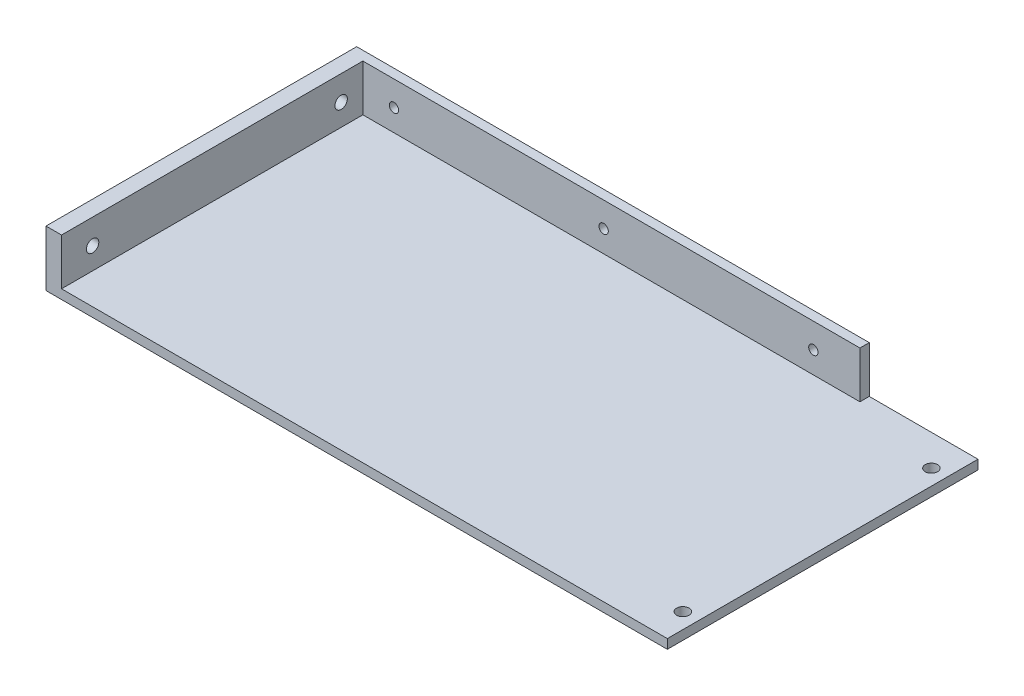
ISO-10303-21;
HEADER;
FILE_DESCRIPTION(('STEP AP214'),'2;1');
FILE_NAME('part.step','',(''),(''),'','','');
FILE_SCHEMA(('AUTOMOTIVE_DESIGN { 1 0 10303 214 1 1 1 1 }'));
ENDSEC;
DATA;
#1=APPLICATION_CONTEXT('core data for automotive mechanical design processes');
#2=APPLICATION_PROTOCOL_DEFINITION('international standard','automotive_design',2000,#1);
#3=PRODUCT_CONTEXT('',#1,'mechanical');
#4=PRODUCT('Part','Part','',(#3));
#5=PRODUCT_RELATED_PRODUCT_CATEGORY('part','',(#4));
#6=PRODUCT_DEFINITION_FORMATION('','',#4);
#7=PRODUCT_DEFINITION_CONTEXT('part definition',#1,'design');
#8=PRODUCT_DEFINITION('design','',#6,#7);
#9=PRODUCT_DEFINITION_SHAPE('','',#8);
#10=(LENGTH_UNIT() NAMED_UNIT(*) SI_UNIT(.MILLI.,.METRE.));
#11=(NAMED_UNIT(*) PLANE_ANGLE_UNIT() SI_UNIT($,.RADIAN.));
#12=(NAMED_UNIT(*) SI_UNIT($,.STERADIAN.) SOLID_ANGLE_UNIT());
#13=UNCERTAINTY_MEASURE_WITH_UNIT(LENGTH_MEASURE(1.E-05),#10,'distance_accuracy_value','');
#14=(GEOMETRIC_REPRESENTATION_CONTEXT(3) GLOBAL_UNCERTAINTY_ASSIGNED_CONTEXT((#13)) GLOBAL_UNIT_ASSIGNED_CONTEXT((#10,
#11,#12)) REPRESENTATION_CONTEXT('',''));
#15=CARTESIAN_POINT('',(0.,0.,0.));
#16=DIRECTION('',(0.,0.,1.));
#17=DIRECTION('',(1.,0.,0.));
#18=AXIS2_PLACEMENT_3D('',#15,#16,#17);
#19=CARTESIAN_POINT('',(0.,3.,0.));
#20=DIRECTION('',(0.,-1.,0.));
#21=DIRECTION('',(0.,0.,-1.));
#22=AXIS2_PLACEMENT_3D('',#19,#20,#21);
#23=PLANE('',#22);
#24=CARTESIAN_POINT('',(95.,3.,-40.));
#25=DIRECTION('',(0.,1.,0.));
#26=DIRECTION('',(0.,0.,1.));
#27=AXIS2_PLACEMENT_3D('',#24,#25,#26);
#28=CIRCLE('',#27,2.);
#29=CARTESIAN_POINT('',(95.,3.,-38.));
#30=VERTEX_POINT('',#29);
#31=EDGE_CURVE('E197',#30,#30,#28,.T.);
#32=ORIENTED_EDGE('',*,*,#31,.F.);
#33=EDGE_LOOP('',(#32));
#34=FACE_BOUND('',#33,.T.);
#35=CARTESIAN_POINT('',(95.,3.,40.));
#36=DIRECTION('',(0.,1.,0.));
#37=DIRECTION('',(0.,0.,1.));
#38=AXIS2_PLACEMENT_3D('',#35,#36,#37);
#39=CIRCLE('',#38,2.);
#40=CARTESIAN_POINT('',(95.,3.,42.));
#41=VERTEX_POINT('',#40);
#42=EDGE_CURVE('E189',#41,#41,#39,.T.);
#43=ORIENTED_EDGE('',*,*,#42,.F.);
#44=EDGE_LOOP('',(#43));
#45=FACE_BOUND('',#44,.T.);
#46=DIRECTION('',(1.,0.,0.));
#47=VECTOR('',#46,1.);
#48=CARTESIAN_POINT('',(-95.,3.,-47.));
#49=LINE('',#48,#47);
#50=CARTESIAN_POINT('',(-95.,3.,-47.));
#51=VERTEX_POINT('',#50);
#52=CARTESIAN_POINT('',(65.,3.,-47.));
#53=VERTEX_POINT('',#52);
#54=EDGE_CURVE('E235',#51,#53,#49,.T.);
#55=ORIENTED_EDGE('',*,*,#54,.F.);
#56=DIRECTION('',(0.,0.,-1.));
#57=VECTOR('',#56,1.);
#58=CARTESIAN_POINT('',(-95.,3.,-50.));
#59=LINE('',#58,#57);
#60=CARTESIAN_POINT('',(-94.9999999999999,3.,50.));
#61=VERTEX_POINT('',#60);
#62=EDGE_CURVE('E59',#61,#51,#59,.T.);
#63=ORIENTED_EDGE('',*,*,#62,.F.);
#64=DIRECTION('',(1.,0.,0.));
#65=VECTOR('',#64,1.);
#66=CARTESIAN_POINT('',(-100.,3.,50.));
#67=LINE('',#66,#65);
#68=CARTESIAN_POINT('',(100.,3.,50.));
#69=VERTEX_POINT('',#68);
#70=EDGE_CURVE('E64',#61,#69,#67,.T.);
#71=ORIENTED_EDGE('',*,*,#70,.T.);
#72=DIRECTION('',(0.,0.,-1.));
#73=VECTOR('',#72,1.);
#74=CARTESIAN_POINT('',(100.,3.,50.));
#75=LINE('',#74,#73);
#76=CARTESIAN_POINT('',(100.,3.,-50.));
#77=VERTEX_POINT('',#76);
#78=EDGE_CURVE('E96',#69,#77,#75,.T.);
#79=ORIENTED_EDGE('',*,*,#78,.T.);
#80=DIRECTION('',(-1.,0.,0.));
#81=VECTOR('',#80,1.);
#82=CARTESIAN_POINT('',(-100.,3.,-50.));
#83=LINE('',#82,#81);
#84=CARTESIAN_POINT('',(65.,3.,-50.));
#85=VERTEX_POINT('',#84);
#86=EDGE_CURVE('E159',#77,#85,#83,.T.);
#87=ORIENTED_EDGE('',*,*,#86,.T.);
#88=DIRECTION('',(0.,0.,-1.));
#89=VECTOR('',#88,1.);
#90=CARTESIAN_POINT('',(65.,3.,-50.));
#91=LINE('',#90,#89);
#92=EDGE_CURVE('E167',#53,#85,#91,.T.);
#93=ORIENTED_EDGE('',*,*,#92,.F.);
#94=EDGE_LOOP('',(#55,#63,#71,#79,#87,#93));
#95=FACE_BOUND('',#94,.T.);
#96=ADVANCED_FACE('F43',(#34,#45,#95),#23,.F.);
#97=CARTESIAN_POINT('',(-95.,18.,-50.));
#98=DIRECTION('',(-1.,0.,0.));
#99=DIRECTION('',(0.,0.,1.));
#100=AXIS2_PLACEMENT_3D('',#97,#98,#99);
#101=PLANE('',#100);
#102=CARTESIAN_POINT('',(-95.,10.,40.));
#103=DIRECTION('',(-1.,0.,0.));
#104=DIRECTION('',(0.,0.,1.));
#105=AXIS2_PLACEMENT_3D('',#102,#103,#104);
#106=CIRCLE('',#105,2.);
#107=CARTESIAN_POINT('',(-95.,10.,42.));
#108=VERTEX_POINT('',#107);
#109=EDGE_CURVE('E156',#108,#108,#106,.F.);
#110=ORIENTED_EDGE('',*,*,#109,.F.);
#111=EDGE_LOOP('',(#110));
#112=FACE_BOUND('',#111,.T.);
#113=CARTESIAN_POINT('',(-95.,10.,-40.));
#114=DIRECTION('',(-1.,0.,0.));
#115=DIRECTION('',(0.,0.,1.));
#116=AXIS2_PLACEMENT_3D('',#113,#114,#115);
#117=CIRCLE('',#116,2.);
#118=CARTESIAN_POINT('',(-95.,10.,-38.));
#119=VERTEX_POINT('',#118);
#120=EDGE_CURVE('E208',#119,#119,#117,.F.);
#121=ORIENTED_EDGE('',*,*,#120,.F.);
#122=EDGE_LOOP('',(#121));
#123=FACE_BOUND('',#122,.T.);
#124=DIRECTION('',(0.,-1.,0.));
#125=VECTOR('',#124,1.);
#126=CARTESIAN_POINT('',(-95.,18.,-47.));
#127=LINE('',#126,#125);
#128=CARTESIAN_POINT('',(-95.,18.,-47.));
#129=VERTEX_POINT('',#128);
#130=EDGE_CURVE('E178',#129,#51,#127,.T.);
#131=ORIENTED_EDGE('',*,*,#130,.F.);
#132=DIRECTION('',(0.,0.,-1.));
#133=VECTOR('',#132,1.);
#134=CARTESIAN_POINT('',(-95.,18.,-50.));
#135=LINE('',#134,#133);
#136=CARTESIAN_POINT('',(-94.9999999999999,18.,50.));
#137=VERTEX_POINT('',#136);
#138=EDGE_CURVE('E147',#137,#129,#135,.T.);
#139=ORIENTED_EDGE('',*,*,#138,.F.);
#140=DIRECTION('',(0.,-1.,0.));
#141=VECTOR('',#140,1.);
#142=CARTESIAN_POINT('',(-94.9999999999999,18.,50.));
#143=LINE('',#142,#141);
#144=EDGE_CURVE('E108',#137,#61,#143,.T.);
#145=ORIENTED_EDGE('',*,*,#144,.T.);
#146=ORIENTED_EDGE('',*,*,#62,.T.);
#147=EDGE_LOOP('',(#131,#139,#145,#146));
#148=FACE_BOUND('',#147,.T.);
#149=ADVANCED_FACE('F226',(#112,#123,#148),#101,.F.);
#150=CARTESIAN_POINT('',(100.,3.,50.));
#151=DIRECTION('',(-1.,0.,0.));
#152=DIRECTION('',(0.,0.,1.));
#153=AXIS2_PLACEMENT_3D('',#150,#151,#152);
#154=PLANE('',#153);
#155=DIRECTION('',(0.,0.,-1.));
#156=VECTOR('',#155,1.);
#157=CARTESIAN_POINT('',(100.,0.,50.));
#158=LINE('',#157,#156);
#159=CARTESIAN_POINT('',(100.,0.,50.));
#160=VERTEX_POINT('',#159);
#161=CARTESIAN_POINT('',(100.,0.,-50.));
#162=VERTEX_POINT('',#161);
#163=EDGE_CURVE('E102',#160,#162,#158,.T.);
#164=ORIENTED_EDGE('',*,*,#163,.T.);
#165=DIRECTION('',(0.,-1.,0.));
#166=VECTOR('',#165,1.);
#167=CARTESIAN_POINT('',(100.,3.,-50.));
#168=LINE('',#167,#166);
#169=EDGE_CURVE('E11',#77,#162,#168,.T.);
#170=ORIENTED_EDGE('',*,*,#169,.F.);
#171=ORIENTED_EDGE('',*,*,#78,.F.);
#172=DIRECTION('',(0.,-1.,0.));
#173=VECTOR('',#172,1.);
#174=CARTESIAN_POINT('',(100.,3.,50.));
#175=LINE('',#174,#173);
#176=EDGE_CURVE('E87',#69,#160,#175,.T.);
#177=ORIENTED_EDGE('',*,*,#176,.T.);
#178=EDGE_LOOP('',(#164,#170,#171,#177));
#179=FACE_BOUND('',#178,.T.);
#180=ADVANCED_FACE('F45',(#179),#154,.F.);
#181=CARTESIAN_POINT('',(-100.,3.,-50.));
#182=DIRECTION('',(0.,0.,1.));
#183=DIRECTION('',(1.,0.,0.));
#184=AXIS2_PLACEMENT_3D('',#181,#182,#183);
#185=PLANE('',#184);
#186=CARTESIAN_POINT('',(-85.,10.,-50.));
#187=DIRECTION('',(0.,0.,-1.));
#188=DIRECTION('',(-1.,0.,0.));
#189=AXIS2_PLACEMENT_3D('',#186,#187,#188);
#190=CIRCLE('',#189,1.5);
#191=CARTESIAN_POINT('',(-86.5,10.,-50.));
#192=VERTEX_POINT('',#191);
#193=EDGE_CURVE('E242',#192,#192,#190,.T.);
#194=ORIENTED_EDGE('',*,*,#193,.F.);
#195=EDGE_LOOP('',(#194));
#196=FACE_BOUND('',#195,.T.);
#197=CARTESIAN_POINT('',(-17.4999999999999,10.,-50.));
#198=DIRECTION('',(0.,0.,-1.));
#199=DIRECTION('',(-1.,0.,0.));
#200=AXIS2_PLACEMENT_3D('',#197,#198,#199);
#201=CIRCLE('',#200,1.5);
#202=CARTESIAN_POINT('',(-18.9999999999999,10.,-50.));
#203=VERTEX_POINT('',#202);
#204=EDGE_CURVE('E256',#203,#203,#201,.T.);
#205=ORIENTED_EDGE('',*,*,#204,.F.);
#206=EDGE_LOOP('',(#205));
#207=FACE_BOUND('',#206,.T.);
#208=CARTESIAN_POINT('',(50.0000000000001,10.,-50.));
#209=DIRECTION('',(0.,0.,-1.));
#210=DIRECTION('',(-1.,0.,0.));
#211=AXIS2_PLACEMENT_3D('',#208,#209,#210);
#212=CIRCLE('',#211,1.5);
#213=CARTESIAN_POINT('',(48.5000000000001,10.,-50.));
#214=VERTEX_POINT('',#213);
#215=EDGE_CURVE('E247',#214,#214,#212,.T.);
#216=ORIENTED_EDGE('',*,*,#215,.F.);
#217=EDGE_LOOP('',(#216));
#218=FACE_BOUND('',#217,.T.);
#219=DIRECTION('',(-1.,0.,0.));
#220=VECTOR('',#219,1.);
#221=CARTESIAN_POINT('',(-100.,0.,-50.));
#222=LINE('',#221,#220);
#223=CARTESIAN_POINT('',(-100.,0.,-50.));
#224=VERTEX_POINT('',#223);
#225=EDGE_CURVE('E106',#162,#224,#222,.T.);
#226=ORIENTED_EDGE('',*,*,#225,.T.);
#227=DIRECTION('',(0.,-1.,0.));
#228=VECTOR('',#227,1.);
#229=CARTESIAN_POINT('',(-100.,3.,-50.));
#230=LINE('',#229,#228);
#231=CARTESIAN_POINT('',(-100.,18.,-50.));
#232=VERTEX_POINT('',#231);
#233=EDGE_CURVE('E52',#232,#224,#230,.T.);
#234=ORIENTED_EDGE('',*,*,#233,.F.);
#235=DIRECTION('',(-1.,0.,0.));
#236=VECTOR('',#235,1.);
#237=CARTESIAN_POINT('',(-100.,18.,-50.));
#238=LINE('',#237,#236);
#239=CARTESIAN_POINT('',(65.,18.,-50.));
#240=VERTEX_POINT('',#239);
#241=EDGE_CURVE('E114',#240,#232,#238,.T.);
#242=ORIENTED_EDGE('',*,*,#241,.F.);
#243=DIRECTION('',(0.,-1.,0.));
#244=VECTOR('',#243,1.);
#245=CARTESIAN_POINT('',(65.,18.,-50.));
#246=LINE('',#245,#244);
#247=EDGE_CURVE('E170',#240,#85,#246,.T.);
#248=ORIENTED_EDGE('',*,*,#247,.T.);
#249=ORIENTED_EDGE('',*,*,#86,.F.);
#250=ORIENTED_EDGE('',*,*,#169,.T.);
#251=EDGE_LOOP('',(#226,#234,#242,#248,#249,#250));
#252=FACE_BOUND('',#251,.T.);
#253=ADVANCED_FACE('F133',(#196,#207,#218,#252),#185,.F.);
#254=CARTESIAN_POINT('',(-100.,3.,50.));
#255=DIRECTION('',(1.,0.,0.));
#256=DIRECTION('',(0.,0.,-1.));
#257=AXIS2_PLACEMENT_3D('',#254,#255,#256);
#258=PLANE('',#257);
#259=CARTESIAN_POINT('',(-100.,10.,-40.));
#260=DIRECTION('',(-1.,0.,0.));
#261=DIRECTION('',(0.,0.,1.));
#262=AXIS2_PLACEMENT_3D('',#259,#260,#261);
#263=CIRCLE('',#262,2.);
#264=CARTESIAN_POINT('',(-100.,10.,-38.));
#265=VERTEX_POINT('',#264);
#266=EDGE_CURVE('E201',#265,#265,#263,.T.);
#267=ORIENTED_EDGE('',*,*,#266,.F.);
#268=EDGE_LOOP('',(#267));
#269=FACE_BOUND('',#268,.T.);
#270=CARTESIAN_POINT('',(-100.,10.,40.));
#271=DIRECTION('',(-1.,0.,0.));
#272=DIRECTION('',(0.,0.,1.));
#273=AXIS2_PLACEMENT_3D('',#270,#271,#272);
#274=CIRCLE('',#273,2.);
#275=CARTESIAN_POINT('',(-100.,10.,42.));
#276=VERTEX_POINT('',#275);
#277=EDGE_CURVE('E212',#276,#276,#274,.T.);
#278=ORIENTED_EDGE('',*,*,#277,.F.);
#279=EDGE_LOOP('',(#278));
#280=FACE_BOUND('',#279,.T.);
#281=DIRECTION('',(0.,0.,1.));
#282=VECTOR('',#281,1.);
#283=CARTESIAN_POINT('',(-100.,0.,50.));
#284=LINE('',#283,#282);
#285=CARTESIAN_POINT('',(-100.,0.,50.));
#286=VERTEX_POINT('',#285);
#287=EDGE_CURVE('E97',#224,#286,#284,.T.);
#288=ORIENTED_EDGE('',*,*,#287,.T.);
#289=DIRECTION('',(0.,-1.,0.));
#290=VECTOR('',#289,1.);
#291=CARTESIAN_POINT('',(-100.,3.,50.));
#292=LINE('',#291,#290);
#293=CARTESIAN_POINT('',(-99.9999999999999,18.,50.));
#294=VERTEX_POINT('',#293);
#295=EDGE_CURVE('E91',#294,#286,#292,.T.);
#296=ORIENTED_EDGE('',*,*,#295,.F.);
#297=DIRECTION('',(0.,0.,1.));
#298=VECTOR('',#297,1.);
#299=CARTESIAN_POINT('',(-100.,18.,-50.));
#300=LINE('',#299,#298);
#301=EDGE_CURVE('E129',#232,#294,#300,.T.);
#302=ORIENTED_EDGE('',*,*,#301,.F.);
#303=ORIENTED_EDGE('',*,*,#233,.T.);
#304=EDGE_LOOP('',(#288,#296,#302,#303));
#305=FACE_BOUND('',#304,.T.);
#306=ADVANCED_FACE('F127',(#269,#280,#305),#258,.F.);
#307=CARTESIAN_POINT('',(-100.,3.,50.));
#308=DIRECTION('',(0.,0.,-1.));
#309=DIRECTION('',(-1.,0.,0.));
#310=AXIS2_PLACEMENT_3D('',#307,#308,#309);
#311=PLANE('',#310);
#312=DIRECTION('',(1.,0.,0.));
#313=VECTOR('',#312,1.);
#314=CARTESIAN_POINT('',(-100.,0.,50.));
#315=LINE('',#314,#313);
#316=EDGE_CURVE('E84',#286,#160,#315,.T.);
#317=ORIENTED_EDGE('',*,*,#316,.T.);
#318=ORIENTED_EDGE('',*,*,#176,.F.);
#319=ORIENTED_EDGE('',*,*,#70,.F.);
#320=ORIENTED_EDGE('',*,*,#144,.F.);
#321=DIRECTION('',(1.,0.,0.));
#322=VECTOR('',#321,1.);
#323=CARTESIAN_POINT('',(-99.9999999999999,18.,50.));
#324=LINE('',#323,#322);
#325=EDGE_CURVE('E151',#294,#137,#324,.T.);
#326=ORIENTED_EDGE('',*,*,#325,.F.);
#327=ORIENTED_EDGE('',*,*,#295,.T.);
#328=EDGE_LOOP('',(#317,#318,#319,#320,#326,#327));
#329=FACE_BOUND('',#328,.T.);
#330=ADVANCED_FACE('F86',(#329),#311,.F.);
#331=CARTESIAN_POINT('',(0.,0.,0.));
#332=DIRECTION('',(0.,-1.,0.));
#333=DIRECTION('',(0.,0.,-1.));
#334=AXIS2_PLACEMENT_3D('',#331,#332,#333);
#335=PLANE('',#334);
#336=CARTESIAN_POINT('',(95.,0.,40.));
#337=DIRECTION('',(0.,-1.,0.));
#338=DIRECTION('',(0.,0.,-1.));
#339=AXIS2_PLACEMENT_3D('',#336,#337,#338);
#340=CIRCLE('',#339,2.);
#341=CARTESIAN_POINT('',(95.,0.,42.));
#342=VERTEX_POINT('',#341);
#343=EDGE_CURVE('E188',#342,#342,#340,.F.);
#344=ORIENTED_EDGE('',*,*,#343,.T.);
#345=EDGE_LOOP('',(#344));
#346=FACE_BOUND('',#345,.T.);
#347=CARTESIAN_POINT('',(95.,0.,-40.));
#348=DIRECTION('',(0.,-1.,0.));
#349=DIRECTION('',(0.,0.,-1.));
#350=AXIS2_PLACEMENT_3D('',#347,#348,#349);
#351=CIRCLE('',#350,2.);
#352=CARTESIAN_POINT('',(95.,0.,-38.));
#353=VERTEX_POINT('',#352);
#354=EDGE_CURVE('E193',#353,#353,#351,.F.);
#355=ORIENTED_EDGE('',*,*,#354,.T.);
#356=EDGE_LOOP('',(#355));
#357=FACE_BOUND('',#356,.T.);
#358=ORIENTED_EDGE('',*,*,#163,.F.);
#359=ORIENTED_EDGE('',*,*,#316,.F.);
#360=ORIENTED_EDGE('',*,*,#287,.F.);
#361=ORIENTED_EDGE('',*,*,#225,.F.);
#362=EDGE_LOOP('',(#358,#359,#360,#361));
#363=FACE_BOUND('',#362,.T.);
#364=ADVANCED_FACE('F105',(#346,#357,#363),#335,.T.);
#365=CARTESIAN_POINT('',(0.,18.,0.));
#366=DIRECTION('',(0.,1.,0.));
#367=DIRECTION('',(0.,0.,1.));
#368=AXIS2_PLACEMENT_3D('',#365,#366,#367);
#369=PLANE('',#368);
#370=ORIENTED_EDGE('',*,*,#301,.T.);
#371=ORIENTED_EDGE('',*,*,#325,.T.);
#372=ORIENTED_EDGE('',*,*,#138,.T.);
#373=DIRECTION('',(1.,0.,0.));
#374=VECTOR('',#373,1.);
#375=CARTESIAN_POINT('',(-95.,18.,-47.));
#376=LINE('',#375,#374);
#377=CARTESIAN_POINT('',(65.,18.,-47.));
#378=VERTEX_POINT('',#377);
#379=EDGE_CURVE('E180',#129,#378,#376,.T.);
#380=ORIENTED_EDGE('',*,*,#379,.T.);
#381=DIRECTION('',(0.,0.,-1.));
#382=VECTOR('',#381,1.);
#383=CARTESIAN_POINT('',(65.,18.,-50.));
#384=LINE('',#383,#382);
#385=EDGE_CURVE('E144',#378,#240,#384,.T.);
#386=ORIENTED_EDGE('',*,*,#385,.T.);
#387=ORIENTED_EDGE('',*,*,#241,.T.);
#388=EDGE_LOOP('',(#370,#371,#372,#380,#386,#387));
#389=FACE_BOUND('',#388,.T.);
#390=ADVANCED_FACE('F139',(#389),#369,.T.);
#391=CARTESIAN_POINT('',(100.001,10.,40.));
#392=DIRECTION('',(-1.,0.,0.));
#393=DIRECTION('',(0.,0.,1.));
#394=AXIS2_PLACEMENT_3D('',#391,#392,#393);
#395=CYLINDRICAL_SURFACE('',#394,2.);
#396=CARTESIAN_POINT('',(-100.,10.,42.));
#397=CARTESIAN_POINT('',(-99.9479166666666,10.,42.));
#398=CARTESIAN_POINT('',(-99.8958333333333,10.,42.));
#399=CARTESIAN_POINT('',(-99.7916666666666,10.,42.));
#400=CARTESIAN_POINT('',(-99.7395833333333,10.,42.));
#401=CARTESIAN_POINT('',(-99.6354166666666,10.,42.));
#402=CARTESIAN_POINT('',(-99.5833333333333,10.,42.));
#403=CARTESIAN_POINT('',(-99.4791666666666,10.,42.));
#404=CARTESIAN_POINT('',(-99.4270833333333,10.,42.));
#405=CARTESIAN_POINT('',(-99.3229166666666,10.,42.));
#406=CARTESIAN_POINT('',(-99.2708333333333,10.,42.));
#407=CARTESIAN_POINT('',(-99.1666666666666,10.,42.));
#408=CARTESIAN_POINT('',(-99.1145833333333,10.,42.));
#409=CARTESIAN_POINT('',(-99.0104166666666,10.,42.));
#410=CARTESIAN_POINT('',(-98.9583333333333,10.,42.));
#411=CARTESIAN_POINT('',(-98.8541666666666,10.,42.));
#412=CARTESIAN_POINT('',(-98.8020833333333,10.,42.));
#413=CARTESIAN_POINT('',(-98.6979166666666,10.,42.));
#414=CARTESIAN_POINT('',(-98.6458333333333,10.,42.));
#415=CARTESIAN_POINT('',(-98.5416666666666,10.,42.));
#416=CARTESIAN_POINT('',(-98.4895833333333,10.,42.));
#417=CARTESIAN_POINT('',(-98.3854166666666,10.,42.));
#418=CARTESIAN_POINT('',(-98.3333333333333,10.,42.));
#419=CARTESIAN_POINT('',(-98.2291666666666,10.,42.));
#420=CARTESIAN_POINT('',(-98.1770833333333,10.,42.));
#421=CARTESIAN_POINT('',(-98.0729166666666,10.,42.));
#422=CARTESIAN_POINT('',(-98.0208333333333,10.,42.));
#423=CARTESIAN_POINT('',(-97.9166666666666,10.,42.));
#424=CARTESIAN_POINT('',(-97.8645833333333,10.,42.));
#425=CARTESIAN_POINT('',(-97.7604166666666,10.,42.));
#426=CARTESIAN_POINT('',(-97.7083333333333,10.,42.));
#427=CARTESIAN_POINT('',(-97.6041666666666,10.,42.));
#428=CARTESIAN_POINT('',(-97.5520833333333,10.,42.));
#429=CARTESIAN_POINT('',(-97.4479166666666,10.,42.));
#430=CARTESIAN_POINT('',(-97.3958333333333,10.,42.));
#431=CARTESIAN_POINT('',(-97.2916666666666,10.,42.));
#432=CARTESIAN_POINT('',(-97.2395833333333,10.,42.));
#433=CARTESIAN_POINT('',(-97.1354166666666,10.,42.));
#434=CARTESIAN_POINT('',(-97.0833333333333,10.,42.));
#435=CARTESIAN_POINT('',(-96.9791666666666,10.,42.));
#436=CARTESIAN_POINT('',(-96.9270833333333,10.,42.));
#437=CARTESIAN_POINT('',(-96.8229166666666,10.,42.));
#438=CARTESIAN_POINT('',(-96.7708333333333,10.,42.));
#439=CARTESIAN_POINT('',(-96.6666666666666,10.,42.));
#440=CARTESIAN_POINT('',(-96.6145833333333,10.,42.));
#441=CARTESIAN_POINT('',(-96.5104166666666,10.,42.));
#442=CARTESIAN_POINT('',(-96.4583333333333,10.,42.));
#443=CARTESIAN_POINT('',(-96.3541666666666,10.,42.));
#444=CARTESIAN_POINT('',(-96.3020833333333,10.,42.));
#445=CARTESIAN_POINT('',(-96.1979166666666,10.,42.));
#446=CARTESIAN_POINT('',(-96.1458333333333,10.,42.));
#447=CARTESIAN_POINT('',(-96.0416666666666,10.,42.));
#448=CARTESIAN_POINT('',(-95.9895833333333,10.,42.));
#449=CARTESIAN_POINT('',(-95.8854166666666,10.,42.));
#450=CARTESIAN_POINT('',(-95.8333333333333,10.,42.));
#451=CARTESIAN_POINT('',(-95.7291666666666,10.,42.));
#452=CARTESIAN_POINT('',(-95.6770833333333,10.,42.));
#453=CARTESIAN_POINT('',(-95.5729166666666,10.,42.));
#454=CARTESIAN_POINT('',(-95.5208333333333,10.,42.));
#455=CARTESIAN_POINT('',(-95.4166666666666,10.,42.));
#456=CARTESIAN_POINT('',(-95.3645833333333,10.,42.));
#457=CARTESIAN_POINT('',(-95.2604166666666,10.,42.));
#458=CARTESIAN_POINT('',(-95.2083333333333,10.,42.));
#459=CARTESIAN_POINT('',(-95.1041666666666,10.,42.));
#460=CARTESIAN_POINT('',(-95.0520833333333,10.,42.));
#461=CARTESIAN_POINT('',(-95.,10.,42.));
#462=B_SPLINE_CURVE_WITH_KNOTS('',3,(#396,#397,#398,#399,#400,#401,#402,#403,#404,#405,#406,
#407,#408,#409,#410,#411,#412,#413,#414,#415,#416,#417,#418,#419,#420,#421,#422,#423,#424,#425,
#426,#427,#428,#429,#430,#431,#432,#433,#434,#435,#436,#437,#438,#439,#440,#441,#442,#443,#444,
#445,#446,#447,#448,#449,#450,#451,#452,#453,#454,#455,#456,#457,#458,#459,#460,#461),
.UNSPECIFIED.,.F.,.F.,(4,2,2,2,2,2,2,2,2,2,2,2,2,2,2,2,2,2,2,2,2,2,2,2,2,2,2,2,2,2,2,2,4),(0.,
0.156249999999997,0.312499999999993,0.46874999999999,0.624999999999987,0.781250000000011,
0.937500000000008,1.09375,1.25,1.40625,1.56249999999999,1.71874999999999,1.87500000000002,
2.03125000000001,2.18750000000001,2.34375000000001,2.5,2.65625,2.8125,2.96874999999999,
3.12499999999999,3.28125000000001,3.43750000000001,3.59375000000001,3.75,3.90625,4.0625,
4.21874999999999,4.37500000000002,4.53125000000001,4.68750000000001,4.84375000000001,5.),.UNSPECIFIED.);
#463=EDGE_CURVE('BSEAM326',#276,#108,#462,.T.);
#464=ORIENTED_EDGE('',*,*,#277,.T.);
#465=ORIENTED_EDGE('',*,*,#109,.T.);
#466=ORIENTED_EDGE('',*,*,#463,.T.);
#467=ORIENTED_EDGE('',*,*,#463,.F.);
#468=EDGE_LOOP('',(#464,#466,#465,#467));
#469=FACE_BOUND('',#468,.T.);
#470=ADVANCED_FACE('F326',(#469),#395,.F.);
#471=CARTESIAN_POINT('',(100.001,10.,-40.));
#472=DIRECTION('',(-1.,0.,0.));
#473=DIRECTION('',(0.,0.,1.));
#474=AXIS2_PLACEMENT_3D('',#471,#472,#473);
#475=CYLINDRICAL_SURFACE('',#474,2.);
#476=CARTESIAN_POINT('',(-100.,10.,-38.));
#477=CARTESIAN_POINT('',(-99.9479166666666,10.,-38.));
#478=CARTESIAN_POINT('',(-99.8958333333333,10.,-38.));
#479=CARTESIAN_POINT('',(-99.7916666666666,10.,-38.));
#480=CARTESIAN_POINT('',(-99.7395833333333,10.,-38.));
#481=CARTESIAN_POINT('',(-99.6354166666666,10.,-38.));
#482=CARTESIAN_POINT('',(-99.5833333333333,10.,-38.));
#483=CARTESIAN_POINT('',(-99.4791666666666,10.,-38.));
#484=CARTESIAN_POINT('',(-99.4270833333333,10.,-38.));
#485=CARTESIAN_POINT('',(-99.3229166666666,10.,-38.));
#486=CARTESIAN_POINT('',(-99.2708333333333,10.,-38.));
#487=CARTESIAN_POINT('',(-99.1666666666666,10.,-38.));
#488=CARTESIAN_POINT('',(-99.1145833333333,10.,-38.));
#489=CARTESIAN_POINT('',(-99.0104166666666,10.,-38.));
#490=CARTESIAN_POINT('',(-98.9583333333333,10.,-38.));
#491=CARTESIAN_POINT('',(-98.8541666666666,10.,-38.));
#492=CARTESIAN_POINT('',(-98.8020833333333,10.,-38.));
#493=CARTESIAN_POINT('',(-98.6979166666666,10.,-38.));
#494=CARTESIAN_POINT('',(-98.6458333333333,10.,-38.));
#495=CARTESIAN_POINT('',(-98.5416666666666,10.,-38.));
#496=CARTESIAN_POINT('',(-98.4895833333333,10.,-38.));
#497=CARTESIAN_POINT('',(-98.3854166666666,10.,-38.));
#498=CARTESIAN_POINT('',(-98.3333333333333,10.,-38.));
#499=CARTESIAN_POINT('',(-98.2291666666666,10.,-38.));
#500=CARTESIAN_POINT('',(-98.1770833333333,10.,-38.));
#501=CARTESIAN_POINT('',(-98.0729166666666,10.,-38.));
#502=CARTESIAN_POINT('',(-98.0208333333333,10.,-38.));
#503=CARTESIAN_POINT('',(-97.9166666666666,10.,-38.));
#504=CARTESIAN_POINT('',(-97.8645833333333,10.,-38.));
#505=CARTESIAN_POINT('',(-97.7604166666666,10.,-38.));
#506=CARTESIAN_POINT('',(-97.7083333333333,10.,-38.));
#507=CARTESIAN_POINT('',(-97.6041666666666,10.,-38.));
#508=CARTESIAN_POINT('',(-97.5520833333333,10.,-38.));
#509=CARTESIAN_POINT('',(-97.4479166666666,10.,-38.));
#510=CARTESIAN_POINT('',(-97.3958333333333,10.,-38.));
#511=CARTESIAN_POINT('',(-97.2916666666666,10.,-38.));
#512=CARTESIAN_POINT('',(-97.2395833333333,10.,-38.));
#513=CARTESIAN_POINT('',(-97.1354166666666,10.,-38.));
#514=CARTESIAN_POINT('',(-97.0833333333333,10.,-38.));
#515=CARTESIAN_POINT('',(-96.9791666666666,10.,-38.));
#516=CARTESIAN_POINT('',(-96.9270833333333,10.,-38.));
#517=CARTESIAN_POINT('',(-96.8229166666666,10.,-38.));
#518=CARTESIAN_POINT('',(-96.7708333333333,10.,-38.));
#519=CARTESIAN_POINT('',(-96.6666666666666,10.,-38.));
#520=CARTESIAN_POINT('',(-96.6145833333333,10.,-38.));
#521=CARTESIAN_POINT('',(-96.5104166666666,10.,-38.));
#522=CARTESIAN_POINT('',(-96.4583333333333,10.,-38.));
#523=CARTESIAN_POINT('',(-96.3541666666666,10.,-38.));
#524=CARTESIAN_POINT('',(-96.3020833333333,10.,-38.));
#525=CARTESIAN_POINT('',(-96.1979166666666,10.,-38.));
#526=CARTESIAN_POINT('',(-96.1458333333333,10.,-38.));
#527=CARTESIAN_POINT('',(-96.0416666666666,10.,-38.));
#528=CARTESIAN_POINT('',(-95.9895833333333,10.,-38.));
#529=CARTESIAN_POINT('',(-95.8854166666666,10.,-38.));
#530=CARTESIAN_POINT('',(-95.8333333333333,10.,-38.));
#531=CARTESIAN_POINT('',(-95.7291666666666,10.,-38.));
#532=CARTESIAN_POINT('',(-95.6770833333333,10.,-38.));
#533=CARTESIAN_POINT('',(-95.5729166666666,10.,-38.));
#534=CARTESIAN_POINT('',(-95.5208333333333,10.,-38.));
#535=CARTESIAN_POINT('',(-95.4166666666666,10.,-38.));
#536=CARTESIAN_POINT('',(-95.3645833333333,10.,-38.));
#537=CARTESIAN_POINT('',(-95.2604166666666,10.,-38.));
#538=CARTESIAN_POINT('',(-95.2083333333333,10.,-38.));
#539=CARTESIAN_POINT('',(-95.1041666666666,10.,-38.));
#540=CARTESIAN_POINT('',(-95.0520833333333,10.,-38.));
#541=CARTESIAN_POINT('',(-95.,10.,-38.));
#542=B_SPLINE_CURVE_WITH_KNOTS('',3,(#476,#477,#478,#479,#480,#481,#482,#483,#484,#485,#486,
#487,#488,#489,#490,#491,#492,#493,#494,#495,#496,#497,#498,#499,#500,#501,#502,#503,#504,#505,
#506,#507,#508,#509,#510,#511,#512,#513,#514,#515,#516,#517,#518,#519,#520,#521,#522,#523,#524,
#525,#526,#527,#528,#529,#530,#531,#532,#533,#534,#535,#536,#537,#538,#539,#540,#541),
.UNSPECIFIED.,.F.,.F.,(4,2,2,2,2,2,2,2,2,2,2,2,2,2,2,2,2,2,2,2,2,2,2,2,2,2,2,2,2,2,2,2,4),(0.,
0.156249999999997,0.312499999999993,0.46874999999999,0.624999999999987,0.781250000000011,
0.937500000000008,1.09375,1.25,1.40625,1.56249999999999,1.71874999999999,1.87500000000002,
2.03125000000001,2.18750000000001,2.34375000000001,2.5,2.65625,2.8125,2.96874999999999,
3.12499999999999,3.28125000000001,3.43750000000001,3.59375000000001,3.75,3.90625,4.0625,
4.21874999999999,4.37500000000002,4.53125000000001,4.68750000000001,4.84375000000001,5.),.UNSPECIFIED.);
#543=EDGE_CURVE('BSEAM329',#265,#119,#542,.T.);
#544=ORIENTED_EDGE('',*,*,#266,.T.);
#545=ORIENTED_EDGE('',*,*,#120,.T.);
#546=ORIENTED_EDGE('',*,*,#543,.T.);
#547=ORIENTED_EDGE('',*,*,#543,.F.);
#548=EDGE_LOOP('',(#544,#546,#545,#547));
#549=FACE_BOUND('',#548,.T.);
#550=ADVANCED_FACE('F329',(#549),#475,.F.);
#551=CARTESIAN_POINT('',(95.,-0.00100000000000013,-40.));
#552=DIRECTION('',(0.,1.,0.));
#553=DIRECTION('',(0.,0.,1.));
#554=AXIS2_PLACEMENT_3D('',#551,#552,#553);
#555=CYLINDRICAL_SURFACE('',#554,2.);
#556=CARTESIAN_POINT('',(95.,0.,-38.));
#557=CARTESIAN_POINT('',(95.,0.03125,-38.));
#558=CARTESIAN_POINT('',(95.,0.0625,-38.));
#559=CARTESIAN_POINT('',(95.,0.125,-38.));
#560=CARTESIAN_POINT('',(95.,0.15625,-38.));
#561=CARTESIAN_POINT('',(95.,0.21875,-38.));
#562=CARTESIAN_POINT('',(95.,0.25,-38.));
#563=CARTESIAN_POINT('',(95.,0.3125,-38.));
#564=CARTESIAN_POINT('',(95.,0.34375,-38.));
#565=CARTESIAN_POINT('',(95.,0.40625,-38.));
#566=CARTESIAN_POINT('',(95.,0.4375,-38.));
#567=CARTESIAN_POINT('',(95.,0.5,-38.));
#568=CARTESIAN_POINT('',(95.,0.53125,-38.));
#569=CARTESIAN_POINT('',(95.,0.59375,-38.));
#570=CARTESIAN_POINT('',(95.,0.625,-38.));
#571=CARTESIAN_POINT('',(95.,0.6875,-38.));
#572=CARTESIAN_POINT('',(95.,0.71875,-38.));
#573=CARTESIAN_POINT('',(95.,0.78125,-38.));
#574=CARTESIAN_POINT('',(95.,0.8125,-38.));
#575=CARTESIAN_POINT('',(95.,0.875,-38.));
#576=CARTESIAN_POINT('',(95.,0.90625,-38.));
#577=CARTESIAN_POINT('',(95.,0.96875,-38.));
#578=CARTESIAN_POINT('',(95.,1.,-38.));
#579=CARTESIAN_POINT('',(95.,1.0625,-38.));
#580=CARTESIAN_POINT('',(95.,1.09375,-38.));
#581=CARTESIAN_POINT('',(95.,1.15625,-38.));
#582=CARTESIAN_POINT('',(95.,1.1875,-38.));
#583=CARTESIAN_POINT('',(95.,1.25,-38.));
#584=CARTESIAN_POINT('',(95.,1.28125,-38.));
#585=CARTESIAN_POINT('',(95.,1.34375,-38.));
#586=CARTESIAN_POINT('',(95.,1.375,-38.));
#587=CARTESIAN_POINT('',(95.,1.4375,-38.));
#588=CARTESIAN_POINT('',(95.,1.46875,-38.));
#589=CARTESIAN_POINT('',(95.,1.53125,-38.));
#590=CARTESIAN_POINT('',(95.,1.5625,-38.));
#591=CARTESIAN_POINT('',(95.,1.625,-38.));
#592=CARTESIAN_POINT('',(95.,1.65625,-38.));
#593=CARTESIAN_POINT('',(95.,1.71875,-38.));
#594=CARTESIAN_POINT('',(95.,1.75,-38.));
#595=CARTESIAN_POINT('',(95.,1.8125,-38.));
#596=CARTESIAN_POINT('',(95.,1.84375,-38.));
#597=CARTESIAN_POINT('',(95.,1.90625,-38.));
#598=CARTESIAN_POINT('',(95.,1.9375,-38.));
#599=CARTESIAN_POINT('',(95.,2.,-38.));
#600=CARTESIAN_POINT('',(95.,2.03125,-38.));
#601=CARTESIAN_POINT('',(95.,2.09375,-38.));
#602=CARTESIAN_POINT('',(95.,2.125,-38.));
#603=CARTESIAN_POINT('',(95.,2.1875,-38.));
#604=CARTESIAN_POINT('',(95.,2.21875,-38.));
#605=CARTESIAN_POINT('',(95.,2.28125,-38.));
#606=CARTESIAN_POINT('',(95.,2.3125,-38.));
#607=CARTESIAN_POINT('',(95.,2.375,-38.));
#608=CARTESIAN_POINT('',(95.,2.40625,-38.));
#609=CARTESIAN_POINT('',(95.,2.46875,-38.));
#610=CARTESIAN_POINT('',(95.,2.5,-38.));
#611=CARTESIAN_POINT('',(95.,2.5625,-38.));
#612=CARTESIAN_POINT('',(95.,2.59375,-38.));
#613=CARTESIAN_POINT('',(95.,2.65625,-38.));
#614=CARTESIAN_POINT('',(95.,2.6875,-38.));
#615=CARTESIAN_POINT('',(95.,2.75,-38.));
#616=CARTESIAN_POINT('',(95.,2.78125,-38.));
#617=CARTESIAN_POINT('',(95.,2.84375,-38.));
#618=CARTESIAN_POINT('',(95.,2.875,-38.));
#619=CARTESIAN_POINT('',(95.,2.9375,-38.));
#620=CARTESIAN_POINT('',(95.,2.96875,-38.));
#621=CARTESIAN_POINT('',(95.,3.,-38.));
#622=B_SPLINE_CURVE_WITH_KNOTS('',3,(#556,#557,#558,#559,#560,#561,#562,#563,#564,#565,#566,
#567,#568,#569,#570,#571,#572,#573,#574,#575,#576,#577,#578,#579,#580,#581,#582,#583,#584,#585,
#586,#587,#588,#589,#590,#591,#592,#593,#594,#595,#596,#597,#598,#599,#600,#601,#602,#603,#604,
#605,#606,#607,#608,#609,#610,#611,#612,#613,#614,#615,#616,#617,#618,#619,#620,#621),
.UNSPECIFIED.,.F.,.F.,(4,2,2,2,2,2,2,2,2,2,2,2,2,2,2,2,2,2,2,2,2,2,2,2,2,2,2,2,2,2,2,2,4),(0.,
0.09375,0.1875,0.28125,0.375,0.46875,0.5625,0.65625,0.75,0.84375,0.9375,1.03125,1.125,1.21875,
1.3125,1.40625,1.5,1.59375,1.6875,1.78125,1.875,1.96875,2.0625,2.15625,2.25,2.34375,2.4375,
2.53125,2.625,2.71875,2.8125,2.90625,3.),.UNSPECIFIED.);
#623=EDGE_CURVE('BSEAM294',#353,#30,#622,.T.);
#624=ORIENTED_EDGE('',*,*,#354,.F.);
#625=ORIENTED_EDGE('',*,*,#31,.T.);
#626=ORIENTED_EDGE('',*,*,#623,.T.);
#627=ORIENTED_EDGE('',*,*,#623,.F.);
#628=EDGE_LOOP('',(#624,#626,#625,#627));
#629=FACE_BOUND('',#628,.T.);
#630=ADVANCED_FACE('F294',(#629),#555,.F.);
#631=CARTESIAN_POINT('',(95.,-0.00100000000000013,40.));
#632=DIRECTION('',(0.,1.,0.));
#633=DIRECTION('',(0.,0.,1.));
#634=AXIS2_PLACEMENT_3D('',#631,#632,#633);
#635=CYLINDRICAL_SURFACE('',#634,2.);
#636=CARTESIAN_POINT('',(95.,0.,42.));
#637=CARTESIAN_POINT('',(95.,0.03125,42.));
#638=CARTESIAN_POINT('',(95.,0.0625,42.));
#639=CARTESIAN_POINT('',(95.,0.125,42.));
#640=CARTESIAN_POINT('',(95.,0.15625,42.));
#641=CARTESIAN_POINT('',(95.,0.21875,42.));
#642=CARTESIAN_POINT('',(95.,0.25,42.));
#643=CARTESIAN_POINT('',(95.,0.3125,42.));
#644=CARTESIAN_POINT('',(95.,0.34375,42.));
#645=CARTESIAN_POINT('',(95.,0.40625,42.));
#646=CARTESIAN_POINT('',(95.,0.4375,42.));
#647=CARTESIAN_POINT('',(95.,0.5,42.));
#648=CARTESIAN_POINT('',(95.,0.53125,42.));
#649=CARTESIAN_POINT('',(95.,0.59375,42.));
#650=CARTESIAN_POINT('',(95.,0.625,42.));
#651=CARTESIAN_POINT('',(95.,0.6875,42.));
#652=CARTESIAN_POINT('',(95.,0.71875,42.));
#653=CARTESIAN_POINT('',(95.,0.78125,42.));
#654=CARTESIAN_POINT('',(95.,0.8125,42.));
#655=CARTESIAN_POINT('',(95.,0.875,42.));
#656=CARTESIAN_POINT('',(95.,0.90625,42.));
#657=CARTESIAN_POINT('',(95.,0.96875,42.));
#658=CARTESIAN_POINT('',(95.,1.,42.));
#659=CARTESIAN_POINT('',(95.,1.0625,42.));
#660=CARTESIAN_POINT('',(95.,1.09375,42.));
#661=CARTESIAN_POINT('',(95.,1.15625,42.));
#662=CARTESIAN_POINT('',(95.,1.1875,42.));
#663=CARTESIAN_POINT('',(95.,1.25,42.));
#664=CARTESIAN_POINT('',(95.,1.28125,42.));
#665=CARTESIAN_POINT('',(95.,1.34375,42.));
#666=CARTESIAN_POINT('',(95.,1.375,42.));
#667=CARTESIAN_POINT('',(95.,1.4375,42.));
#668=CARTESIAN_POINT('',(95.,1.46875,42.));
#669=CARTESIAN_POINT('',(95.,1.53125,42.));
#670=CARTESIAN_POINT('',(95.,1.5625,42.));
#671=CARTESIAN_POINT('',(95.,1.625,42.));
#672=CARTESIAN_POINT('',(95.,1.65625,42.));
#673=CARTESIAN_POINT('',(95.,1.71875,42.));
#674=CARTESIAN_POINT('',(95.,1.75,42.));
#675=CARTESIAN_POINT('',(95.,1.8125,42.));
#676=CARTESIAN_POINT('',(95.,1.84375,42.));
#677=CARTESIAN_POINT('',(95.,1.90625,42.));
#678=CARTESIAN_POINT('',(95.,1.9375,42.));
#679=CARTESIAN_POINT('',(95.,2.,42.));
#680=CARTESIAN_POINT('',(95.,2.03125,42.));
#681=CARTESIAN_POINT('',(95.,2.09375,42.));
#682=CARTESIAN_POINT('',(95.,2.125,42.));
#683=CARTESIAN_POINT('',(95.,2.1875,42.));
#684=CARTESIAN_POINT('',(95.,2.21875,42.));
#685=CARTESIAN_POINT('',(95.,2.28125,42.));
#686=CARTESIAN_POINT('',(95.,2.3125,42.));
#687=CARTESIAN_POINT('',(95.,2.375,42.));
#688=CARTESIAN_POINT('',(95.,2.40625,42.));
#689=CARTESIAN_POINT('',(95.,2.46875,42.));
#690=CARTESIAN_POINT('',(95.,2.5,42.));
#691=CARTESIAN_POINT('',(95.,2.5625,42.));
#692=CARTESIAN_POINT('',(95.,2.59375,42.));
#693=CARTESIAN_POINT('',(95.,2.65625,42.));
#694=CARTESIAN_POINT('',(95.,2.6875,42.));
#695=CARTESIAN_POINT('',(95.,2.75,42.));
#696=CARTESIAN_POINT('',(95.,2.78125,42.));
#697=CARTESIAN_POINT('',(95.,2.84375,42.));
#698=CARTESIAN_POINT('',(95.,2.875,42.));
#699=CARTESIAN_POINT('',(95.,2.9375,42.));
#700=CARTESIAN_POINT('',(95.,2.96875,42.));
#701=CARTESIAN_POINT('',(95.,3.,42.));
#702=B_SPLINE_CURVE_WITH_KNOTS('',3,(#636,#637,#638,#639,#640,#641,#642,#643,#644,#645,#646,
#647,#648,#649,#650,#651,#652,#653,#654,#655,#656,#657,#658,#659,#660,#661,#662,#663,#664,#665,
#666,#667,#668,#669,#670,#671,#672,#673,#674,#675,#676,#677,#678,#679,#680,#681,#682,#683,#684,
#685,#686,#687,#688,#689,#690,#691,#692,#693,#694,#695,#696,#697,#698,#699,#700,#701),
.UNSPECIFIED.,.F.,.F.,(4,2,2,2,2,2,2,2,2,2,2,2,2,2,2,2,2,2,2,2,2,2,2,2,2,2,2,2,2,2,2,2,4),(0.,
0.09375,0.1875,0.28125,0.375,0.46875,0.5625,0.65625,0.75,0.84375,0.9375,1.03125,1.125,1.21875,
1.3125,1.40625,1.5,1.59375,1.6875,1.78125,1.875,1.96875,2.0625,2.15625,2.25,2.34375,2.4375,
2.53125,2.625,2.71875,2.8125,2.90625,3.),.UNSPECIFIED.);
#703=EDGE_CURVE('BSEAM285',#342,#41,#702,.T.);
#704=ORIENTED_EDGE('',*,*,#343,.F.);
#705=ORIENTED_EDGE('',*,*,#42,.T.);
#706=ORIENTED_EDGE('',*,*,#703,.T.);
#707=ORIENTED_EDGE('',*,*,#703,.F.);
#708=EDGE_LOOP('',(#704,#706,#705,#707));
#709=FACE_BOUND('',#708,.T.);
#710=ADVANCED_FACE('F285',(#709),#635,.F.);
#711=CARTESIAN_POINT('',(-95.,18.,-47.));
#712=DIRECTION('',(0.,0.,-1.));
#713=DIRECTION('',(-1.,0.,0.));
#714=AXIS2_PLACEMENT_3D('',#711,#712,#713);
#715=PLANE('',#714);
#716=CARTESIAN_POINT('',(-85.,10.,-47.));
#717=DIRECTION('',(0.,0.,-1.));
#718=DIRECTION('',(-1.,0.,0.));
#719=AXIS2_PLACEMENT_3D('',#716,#717,#718);
#720=CIRCLE('',#719,1.5);
#721=CARTESIAN_POINT('',(-86.5,10.,-47.));
#722=VERTEX_POINT('',#721);
#723=EDGE_CURVE('E238',#722,#722,#720,.F.);
#724=ORIENTED_EDGE('',*,*,#723,.F.);
#725=EDGE_LOOP('',(#724));
#726=FACE_BOUND('',#725,.T.);
#727=CARTESIAN_POINT('',(-17.4999999999999,10.,-47.));
#728=DIRECTION('',(0.,0.,-1.));
#729=DIRECTION('',(-1.,0.,0.));
#730=AXIS2_PLACEMENT_3D('',#727,#728,#729);
#731=CIRCLE('',#730,1.5);
#732=CARTESIAN_POINT('',(-18.9999999999999,10.,-47.));
#733=VERTEX_POINT('',#732);
#734=EDGE_CURVE('E251',#733,#733,#731,.F.);
#735=ORIENTED_EDGE('',*,*,#734,.F.);
#736=EDGE_LOOP('',(#735));
#737=FACE_BOUND('',#736,.T.);
#738=CARTESIAN_POINT('',(50.0000000000001,10.,-47.));
#739=DIRECTION('',(0.,0.,-1.));
#740=DIRECTION('',(-1.,0.,0.));
#741=AXIS2_PLACEMENT_3D('',#738,#739,#740);
#742=CIRCLE('',#741,1.5);
#743=CARTESIAN_POINT('',(48.5000000000001,10.,-47.));
#744=VERTEX_POINT('',#743);
#745=EDGE_CURVE('E252',#744,#744,#742,.F.);
#746=ORIENTED_EDGE('',*,*,#745,.F.);
#747=EDGE_LOOP('',(#746));
#748=FACE_BOUND('',#747,.T.);
#749=ORIENTED_EDGE('',*,*,#54,.T.);
#750=DIRECTION('',(0.,-1.,0.));
#751=VECTOR('',#750,1.);
#752=CARTESIAN_POINT('',(65.,18.,-47.));
#753=LINE('',#752,#751);
#754=EDGE_CURVE('E173',#378,#53,#753,.T.);
#755=ORIENTED_EDGE('',*,*,#754,.F.);
#756=ORIENTED_EDGE('',*,*,#379,.F.);
#757=ORIENTED_EDGE('',*,*,#130,.T.);
#758=EDGE_LOOP('',(#749,#755,#756,#757));
#759=FACE_BOUND('',#758,.T.);
#760=ADVANCED_FACE('F233',(#726,#737,#748,#759),#715,.F.);
#761=CARTESIAN_POINT('',(65.,18.,-50.));
#762=DIRECTION('',(-1.,0.,0.));
#763=DIRECTION('',(0.,0.,1.));
#764=AXIS2_PLACEMENT_3D('',#761,#762,#763);
#765=PLANE('',#764);
#766=ORIENTED_EDGE('',*,*,#92,.T.);
#767=ORIENTED_EDGE('',*,*,#247,.F.);
#768=ORIENTED_EDGE('',*,*,#385,.F.);
#769=ORIENTED_EDGE('',*,*,#754,.T.);
#770=EDGE_LOOP('',(#766,#767,#768,#769));
#771=FACE_BOUND('',#770,.T.);
#772=ADVANCED_FACE('F280',(#771),#765,.F.);
#773=CARTESIAN_POINT('',(50.0000000000001,10.,50.001));
#774=DIRECTION('',(0.,0.,-1.));
#775=DIRECTION('',(-1.,0.,0.));
#776=AXIS2_PLACEMENT_3D('',#773,#774,#775);
#777=CYLINDRICAL_SURFACE('',#776,1.5);
#778=ORIENTED_EDGE('',*,*,#215,.T.);
#779=EDGE_LOOP('',(#778));
#780=FACE_BOUND('',#779,.T.);
#781=ORIENTED_EDGE('',*,*,#745,.T.);
#782=EDGE_LOOP('',(#781));
#783=FACE_BOUND('',#782,.T.);
#784=ADVANCED_FACE('F276',(#780,#783),#777,.F.);
#785=CARTESIAN_POINT('',(-17.4999999999999,10.,50.001));
#786=DIRECTION('',(0.,0.,-1.));
#787=DIRECTION('',(-1.,0.,0.));
#788=AXIS2_PLACEMENT_3D('',#785,#786,#787);
#789=CYLINDRICAL_SURFACE('',#788,1.5);
#790=ORIENTED_EDGE('',*,*,#204,.T.);
#791=EDGE_LOOP('',(#790));
#792=FACE_BOUND('',#791,.T.);
#793=ORIENTED_EDGE('',*,*,#734,.T.);
#794=EDGE_LOOP('',(#793));
#795=FACE_BOUND('',#794,.T.);
#796=ADVANCED_FACE('F279',(#792,#795),#789,.F.);
#797=CARTESIAN_POINT('',(-85.,10.,50.001));
#798=DIRECTION('',(0.,0.,-1.));
#799=DIRECTION('',(-1.,0.,0.));
#800=AXIS2_PLACEMENT_3D('',#797,#798,#799);
#801=CYLINDRICAL_SURFACE('',#800,1.5);
#802=ORIENTED_EDGE('',*,*,#193,.T.);
#803=EDGE_LOOP('',(#802));
#804=FACE_BOUND('',#803,.T.);
#805=ORIENTED_EDGE('',*,*,#723,.T.);
#806=EDGE_LOOP('',(#805));
#807=FACE_BOUND('',#806,.T.);
#808=ADVANCED_FACE('F267',(#804,#807),#801,.F.);
#809=CLOSED_SHELL('',(#96,#149,#180,#253,#306,#330,#364,#390,#470,#550,#630,#710,#760,#772,#784,
#796,#808));
#810=MANIFOLD_SOLID_BREP('B2',#809);
#811=ADVANCED_BREP_SHAPE_REPRESENTATION('',(#18,#810),#14);
#812=SHAPE_DEFINITION_REPRESENTATION(#9,#811);
ENDSEC;
END-ISO-10303-21;
